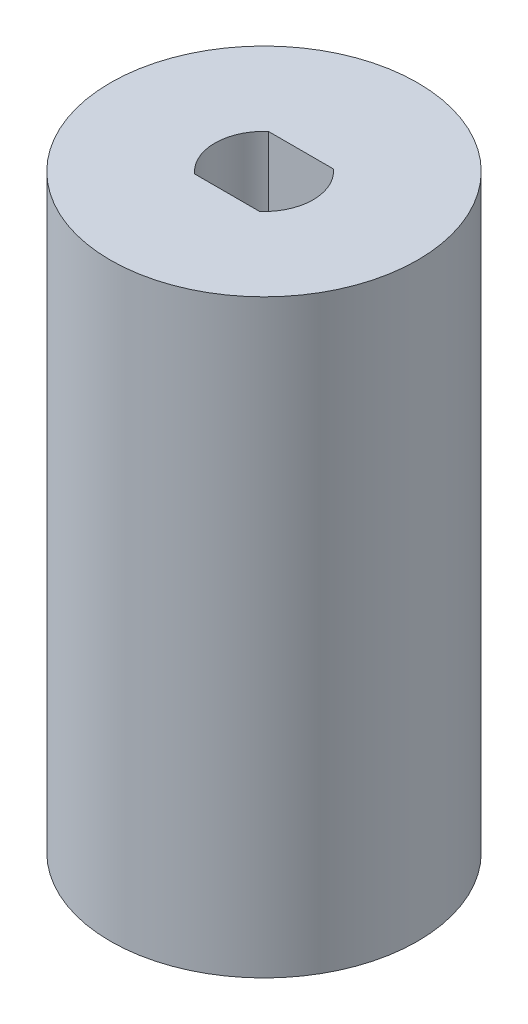
ISO-10303-21;
HEADER;
FILE_DESCRIPTION(('STEP AP214'),'2;1');
FILE_NAME('part.step','',(''),(''),'','','');
FILE_SCHEMA(('AUTOMOTIVE_DESIGN { 1 0 10303 214 1 1 1 1 }'));
ENDSEC;
DATA;
#1=APPLICATION_CONTEXT('core data for automotive mechanical design processes');
#2=APPLICATION_PROTOCOL_DEFINITION('international standard','automotive_design',2000,#1);
#3=PRODUCT_CONTEXT('',#1,'mechanical');
#4=PRODUCT('Part','Part','',(#3));
#5=PRODUCT_RELATED_PRODUCT_CATEGORY('part','',(#4));
#6=PRODUCT_DEFINITION_FORMATION('','',#4);
#7=PRODUCT_DEFINITION_CONTEXT('part definition',#1,'design');
#8=PRODUCT_DEFINITION('design','',#6,#7);
#9=PRODUCT_DEFINITION_SHAPE('','',#8);
#10=(LENGTH_UNIT() NAMED_UNIT(*) SI_UNIT(.MILLI.,.METRE.));
#11=(NAMED_UNIT(*) PLANE_ANGLE_UNIT() SI_UNIT($,.RADIAN.));
#12=(NAMED_UNIT(*) SI_UNIT($,.STERADIAN.) SOLID_ANGLE_UNIT());
#13=UNCERTAINTY_MEASURE_WITH_UNIT(LENGTH_MEASURE(1.E-05),#10,'distance_accuracy_value','');
#14=(GEOMETRIC_REPRESENTATION_CONTEXT(3) GLOBAL_UNCERTAINTY_ASSIGNED_CONTEXT((#13)) GLOBAL_UNIT_ASSIGNED_CONTEXT((#10,
#11,#12)) REPRESENTATION_CONTEXT('',''));
#15=CARTESIAN_POINT('',(0.,0.,0.));
#16=DIRECTION('',(0.,0.,1.));
#17=DIRECTION('',(1.,0.,0.));
#18=AXIS2_PLACEMENT_3D('',#15,#16,#17);
#19=CARTESIAN_POINT('',(0.,48.,0.));
#20=DIRECTION('',(0.,1.,0.));
#21=DIRECTION('',(0.,0.,1.));
#22=AXIS2_PLACEMENT_3D('',#19,#20,#21);
#23=PLANE('',#22);
#24=CARTESIAN_POINT('',(0.,48.,0.));
#25=DIRECTION('',(0.,1.,0.));
#26=DIRECTION('',(0.,0.,1.));
#27=AXIS2_PLACEMENT_3D('',#24,#25,#26);
#28=CIRCLE('',#27,12.5);
#29=CARTESIAN_POINT('',(0.,48.,12.5));
#30=VERTEX_POINT('',#29);
#31=EDGE_CURVE('E11',#30,#30,#28,.T.);
#32=ORIENTED_EDGE('',*,*,#31,.T.);
#33=EDGE_LOOP('',(#32));
#34=FACE_BOUND('',#33,.T.);
#35=DIRECTION('',(1.,0.,0.));
#36=VECTOR('',#35,1.);
#37=CARTESIAN_POINT('',(-2.64575131106459,48.,3.));
#38=LINE('',#37,#36);
#39=CARTESIAN_POINT('',(-2.64575131106459,48.,3.));
#40=VERTEX_POINT('',#39);
#41=CARTESIAN_POINT('',(2.64575131106459,48.,3.));
#42=VERTEX_POINT('',#41);
#43=EDGE_CURVE('E124',#40,#42,#38,.T.);
#44=ORIENTED_EDGE('',*,*,#43,.F.);
#45=CARTESIAN_POINT('',(0.,48.,0.));
#46=DIRECTION('',(0.,1.,0.));
#47=DIRECTION('',(0.,0.,1.));
#48=AXIS2_PLACEMENT_3D('',#45,#46,#47);
#49=CIRCLE('',#48,4.);
#50=CARTESIAN_POINT('',(-2.64575131106459,48.,-3.));
#51=VERTEX_POINT('',#50);
#52=EDGE_CURVE('E112',#51,#40,#49,.T.);
#53=ORIENTED_EDGE('',*,*,#52,.F.);
#54=DIRECTION('',(-1.,0.,0.));
#55=VECTOR('',#54,1.);
#56=CARTESIAN_POINT('',(-2.64575131106459,48.,-3.));
#57=LINE('',#56,#55);
#58=CARTESIAN_POINT('',(2.64575131106459,48.,-3.));
#59=VERTEX_POINT('',#58);
#60=EDGE_CURVE('E140',#59,#51,#57,.T.);
#61=ORIENTED_EDGE('',*,*,#60,.F.);
#62=CARTESIAN_POINT('',(0.,48.,0.));
#63=DIRECTION('',(0.,1.,0.));
#64=DIRECTION('',(0.,0.,1.));
#65=AXIS2_PLACEMENT_3D('',#62,#63,#64);
#66=CIRCLE('',#65,4.);
#67=EDGE_CURVE('E136',#42,#59,#66,.T.);
#68=ORIENTED_EDGE('',*,*,#67,.F.);
#69=EDGE_LOOP('',(#44,#53,#61,#68));
#70=FACE_BOUND('',#69,.T.);
#71=ADVANCED_FACE('F42',(#34,#70),#23,.T.);
#72=CARTESIAN_POINT('',(0.,0.,0.));
#73=DIRECTION('',(0.,1.,0.));
#74=DIRECTION('',(0.,0.,1.));
#75=AXIS2_PLACEMENT_3D('',#72,#73,#74);
#76=PLANE('',#75);
#77=CARTESIAN_POINT('',(0.,0.,0.));
#78=DIRECTION('',(0.,1.,0.));
#79=DIRECTION('',(0.,0.,1.));
#80=AXIS2_PLACEMENT_3D('',#77,#78,#79);
#81=CIRCLE('',#80,12.5);
#82=CARTESIAN_POINT('',(0.,0.,12.5));
#83=VERTEX_POINT('',#82);
#84=EDGE_CURVE('E46',#83,#83,#81,.T.);
#85=ORIENTED_EDGE('',*,*,#84,.F.);
#86=EDGE_LOOP('',(#85));
#87=FACE_BOUND('',#86,.T.);
#88=CARTESIAN_POINT('',(0.,0.,0.));
#89=DIRECTION('',(0.,1.,0.));
#90=DIRECTION('',(0.,0.,1.));
#91=AXIS2_PLACEMENT_3D('',#88,#89,#90);
#92=CIRCLE('',#91,4.);
#93=CARTESIAN_POINT('',(-2.64575131106459,0.,-3.));
#94=VERTEX_POINT('',#93);
#95=CARTESIAN_POINT('',(-2.64575131106459,0.,3.));
#96=VERTEX_POINT('',#95);
#97=EDGE_CURVE('E66',#94,#96,#92,.T.);
#98=ORIENTED_EDGE('',*,*,#97,.T.);
#99=DIRECTION('',(1.,0.,0.));
#100=VECTOR('',#99,1.);
#101=CARTESIAN_POINT('',(-2.64575131106459,0.,3.));
#102=LINE('',#101,#100);
#103=CARTESIAN_POINT('',(2.64575131106459,0.,3.));
#104=VERTEX_POINT('',#103);
#105=EDGE_CURVE('E178',#96,#104,#102,.T.);
#106=ORIENTED_EDGE('',*,*,#105,.T.);
#107=CARTESIAN_POINT('',(0.,0.,0.));
#108=DIRECTION('',(0.,1.,0.));
#109=DIRECTION('',(0.,0.,1.));
#110=AXIS2_PLACEMENT_3D('',#107,#108,#109);
#111=CIRCLE('',#110,4.);
#112=CARTESIAN_POINT('',(2.64575131106459,0.,-3.));
#113=VERTEX_POINT('',#112);
#114=EDGE_CURVE('E182',#104,#113,#111,.T.);
#115=ORIENTED_EDGE('',*,*,#114,.T.);
#116=DIRECTION('',(-1.,0.,0.));
#117=VECTOR('',#116,1.);
#118=CARTESIAN_POINT('',(-2.64575131106459,0.,-3.));
#119=LINE('',#118,#117);
#120=EDGE_CURVE('E166',#113,#94,#119,.T.);
#121=ORIENTED_EDGE('',*,*,#120,.T.);
#122=EDGE_LOOP('',(#98,#106,#115,#121));
#123=FACE_BOUND('',#122,.T.);
#124=ADVANCED_FACE('F205',(#87,#123),#76,.F.);
#125=CARTESIAN_POINT('',(0.,48.,0.));
#126=DIRECTION('',(0.,-1.,0.));
#127=DIRECTION('',(0.,0.,-1.));
#128=AXIS2_PLACEMENT_3D('',#125,#126,#127);
#129=CYLINDRICAL_SURFACE('',#128,12.5);
#130=ORIENTED_EDGE('',*,*,#31,.F.);
#131=EDGE_LOOP('',(#130));
#132=FACE_BOUND('',#131,.T.);
#133=ORIENTED_EDGE('',*,*,#84,.T.);
#134=EDGE_LOOP('',(#133));
#135=FACE_BOUND('',#134,.T.);
#136=ADVANCED_FACE('F44',(#132,#135),#129,.T.);
#137=CARTESIAN_POINT('',(0.,15.,0.));
#138=DIRECTION('',(0.,-1.,0.));
#139=DIRECTION('',(0.,0.,-1.));
#140=AXIS2_PLACEMENT_3D('',#137,#138,#139);
#141=CYLINDRICAL_SURFACE('',#140,4.);
#142=ORIENTED_EDGE('',*,*,#97,.F.);
#143=DIRECTION('',(0.,-1.,0.));
#144=VECTOR('',#143,1.);
#145=CARTESIAN_POINT('',(-2.64575131106459,15.,-3.));
#146=LINE('',#145,#144);
#147=CARTESIAN_POINT('',(-2.64575131106459,15.,-3.));
#148=VERTEX_POINT('',#147);
#149=EDGE_CURVE('E175',#148,#94,#146,.T.);
#150=ORIENTED_EDGE('',*,*,#149,.F.);
#151=CARTESIAN_POINT('',(0.,15.,0.));
#152=DIRECTION('',(0.,1.,0.));
#153=DIRECTION('',(0.,0.,1.));
#154=AXIS2_PLACEMENT_3D('',#151,#152,#153);
#155=CIRCLE('',#154,4.);
#156=CARTESIAN_POINT('',(-2.64575131106459,15.,3.));
#157=VERTEX_POINT('',#156);
#158=EDGE_CURVE('E161',#148,#157,#155,.T.);
#159=ORIENTED_EDGE('',*,*,#158,.T.);
#160=DIRECTION('',(0.,-1.,0.));
#161=VECTOR('',#160,1.);
#162=CARTESIAN_POINT('',(-2.64575131106459,15.,3.));
#163=LINE('',#162,#161);
#164=EDGE_CURVE('E197',#157,#96,#163,.T.);
#165=ORIENTED_EDGE('',*,*,#164,.T.);
#166=EDGE_LOOP('',(#142,#150,#159,#165));
#167=FACE_BOUND('',#166,.T.);
#168=ADVANCED_FACE('F215',(#167),#141,.F.);
#169=CARTESIAN_POINT('',(-2.64575131106459,15.,3.));
#170=DIRECTION('',(0.,0.,-1.));
#171=DIRECTION('',(-1.,0.,0.));
#172=AXIS2_PLACEMENT_3D('',#169,#170,#171);
#173=PLANE('',#172);
#174=ORIENTED_EDGE('',*,*,#105,.F.);
#175=ORIENTED_EDGE('',*,*,#164,.F.);
#176=DIRECTION('',(1.,0.,0.));
#177=VECTOR('',#176,1.);
#178=CARTESIAN_POINT('',(-2.64575131106459,15.,3.));
#179=LINE('',#178,#177);
#180=CARTESIAN_POINT('',(2.64575131106459,15.,3.));
#181=VERTEX_POINT('',#180);
#182=EDGE_CURVE('E165',#157,#181,#179,.T.);
#183=ORIENTED_EDGE('',*,*,#182,.T.);
#184=DIRECTION('',(0.,-1.,0.));
#185=VECTOR('',#184,1.);
#186=CARTESIAN_POINT('',(2.64575131106459,15.,3.));
#187=LINE('',#186,#185);
#188=EDGE_CURVE('E194',#181,#104,#187,.T.);
#189=ORIENTED_EDGE('',*,*,#188,.T.);
#190=EDGE_LOOP('',(#174,#175,#183,#189));
#191=FACE_BOUND('',#190,.T.);
#192=ADVANCED_FACE('F221',(#191),#173,.T.);
#193=CARTESIAN_POINT('',(0.,15.,0.));
#194=DIRECTION('',(0.,-1.,0.));
#195=DIRECTION('',(0.,0.,-1.));
#196=AXIS2_PLACEMENT_3D('',#193,#194,#195);
#197=CYLINDRICAL_SURFACE('',#196,4.);
#198=ORIENTED_EDGE('',*,*,#114,.F.);
#199=ORIENTED_EDGE('',*,*,#188,.F.);
#200=CARTESIAN_POINT('',(0.,15.,0.));
#201=DIRECTION('',(0.,1.,0.));
#202=DIRECTION('',(0.,0.,1.));
#203=AXIS2_PLACEMENT_3D('',#200,#201,#202);
#204=CIRCLE('',#203,4.);
#205=CARTESIAN_POINT('',(2.64575131106459,15.,-3.));
#206=VERTEX_POINT('',#205);
#207=EDGE_CURVE('E169',#181,#206,#204,.T.);
#208=ORIENTED_EDGE('',*,*,#207,.T.);
#209=DIRECTION('',(0.,-1.,0.));
#210=VECTOR('',#209,1.);
#211=CARTESIAN_POINT('',(2.64575131106459,15.,-3.));
#212=LINE('',#211,#210);
#213=EDGE_CURVE('E191',#206,#113,#212,.T.);
#214=ORIENTED_EDGE('',*,*,#213,.T.);
#215=EDGE_LOOP('',(#198,#199,#208,#214));
#216=FACE_BOUND('',#215,.T.);
#217=ADVANCED_FACE('F223',(#216),#197,.F.);
#218=CARTESIAN_POINT('',(-2.64575131106459,15.,-3.));
#219=DIRECTION('',(0.,0.,1.));
#220=DIRECTION('',(1.,0.,0.));
#221=AXIS2_PLACEMENT_3D('',#218,#219,#220);
#222=PLANE('',#221);
#223=ORIENTED_EDGE('',*,*,#120,.F.);
#224=ORIENTED_EDGE('',*,*,#213,.F.);
#225=DIRECTION('',(-1.,0.,0.));
#226=VECTOR('',#225,1.);
#227=CARTESIAN_POINT('',(-2.64575131106459,15.,-3.));
#228=LINE('',#227,#226);
#229=EDGE_CURVE('E172',#206,#148,#228,.T.);
#230=ORIENTED_EDGE('',*,*,#229,.T.);
#231=ORIENTED_EDGE('',*,*,#149,.T.);
#232=EDGE_LOOP('',(#223,#224,#230,#231));
#233=FACE_BOUND('',#232,.T.);
#234=ADVANCED_FACE('F212',(#233),#222,.T.);
#235=CARTESIAN_POINT('',(0.,15.,0.));
#236=DIRECTION('',(0.,1.,0.));
#237=DIRECTION('',(0.,0.,1.));
#238=AXIS2_PLACEMENT_3D('',#235,#236,#237);
#239=PLANE('',#238);
#240=ORIENTED_EDGE('',*,*,#158,.F.);
#241=ORIENTED_EDGE('',*,*,#229,.F.);
#242=ORIENTED_EDGE('',*,*,#207,.F.);
#243=ORIENTED_EDGE('',*,*,#182,.F.);
#244=EDGE_LOOP('',(#240,#241,#242,#243));
#245=FACE_BOUND('',#244,.T.);
#246=ADVANCED_FACE('F217',(#245),#239,.F.);
#247=CARTESIAN_POINT('',(0.,48.,0.));
#248=DIRECTION('',(0.,-1.,0.));
#249=DIRECTION('',(0.,0.,-1.));
#250=AXIS2_PLACEMENT_3D('',#247,#248,#249);
#251=CYLINDRICAL_SURFACE('',#250,4.);
#252=CARTESIAN_POINT('',(0.,33.,0.));
#253=DIRECTION('',(0.,1.,0.));
#254=DIRECTION('',(0.,0.,1.));
#255=AXIS2_PLACEMENT_3D('',#252,#253,#254);
#256=CIRCLE('',#255,4.);
#257=CARTESIAN_POINT('',(-2.64575131106459,33.,-3.));
#258=VERTEX_POINT('',#257);
#259=CARTESIAN_POINT('',(-2.64575131106459,33.,3.));
#260=VERTEX_POINT('',#259);
#261=EDGE_CURVE('E145',#258,#260,#256,.T.);
#262=ORIENTED_EDGE('',*,*,#261,.F.);
#263=DIRECTION('',(0.,-1.,0.));
#264=VECTOR('',#263,1.);
#265=CARTESIAN_POINT('',(-2.64575131106459,48.,-3.));
#266=LINE('',#265,#264);
#267=EDGE_CURVE('E119',#51,#258,#266,.T.);
#268=ORIENTED_EDGE('',*,*,#267,.F.);
#269=ORIENTED_EDGE('',*,*,#52,.T.);
#270=DIRECTION('',(0.,-1.,0.));
#271=VECTOR('',#270,1.);
#272=CARTESIAN_POINT('',(-2.64575131106459,48.,3.));
#273=LINE('',#272,#271);
#274=EDGE_CURVE('E116',#40,#260,#273,.T.);
#275=ORIENTED_EDGE('',*,*,#274,.T.);
#276=EDGE_LOOP('',(#262,#268,#269,#275));
#277=FACE_BOUND('',#276,.T.);
#278=ADVANCED_FACE('F115',(#277),#251,.F.);
#279=CARTESIAN_POINT('',(-2.64575131106459,48.,3.));
#280=DIRECTION('',(0.,0.,-1.));
#281=DIRECTION('',(-1.,0.,0.));
#282=AXIS2_PLACEMENT_3D('',#279,#280,#281);
#283=PLANE('',#282);
#284=DIRECTION('',(1.,0.,0.));
#285=VECTOR('',#284,1.);
#286=CARTESIAN_POINT('',(-2.64575131106459,33.,3.));
#287=LINE('',#286,#285);
#288=CARTESIAN_POINT('',(2.64575131106459,33.,3.));
#289=VERTEX_POINT('',#288);
#290=EDGE_CURVE('E131',#260,#289,#287,.T.);
#291=ORIENTED_EDGE('',*,*,#290,.F.);
#292=ORIENTED_EDGE('',*,*,#274,.F.);
#293=ORIENTED_EDGE('',*,*,#43,.T.);
#294=DIRECTION('',(0.,-1.,0.));
#295=VECTOR('',#294,1.);
#296=CARTESIAN_POINT('',(2.64575131106459,48.,3.));
#297=LINE('',#296,#295);
#298=EDGE_CURVE('E133',#42,#289,#297,.T.);
#299=ORIENTED_EDGE('',*,*,#298,.T.);
#300=EDGE_LOOP('',(#291,#292,#293,#299));
#301=FACE_BOUND('',#300,.T.);
#302=ADVANCED_FACE('F128',(#301),#283,.T.);
#303=CARTESIAN_POINT('',(0.,48.,0.));
#304=DIRECTION('',(0.,-1.,0.));
#305=DIRECTION('',(0.,0.,-1.));
#306=AXIS2_PLACEMENT_3D('',#303,#304,#305);
#307=CYLINDRICAL_SURFACE('',#306,4.);
#308=CARTESIAN_POINT('',(0.,33.,0.));
#309=DIRECTION('',(0.,1.,0.));
#310=DIRECTION('',(0.,0.,1.));
#311=AXIS2_PLACEMENT_3D('',#308,#309,#310);
#312=CIRCLE('',#311,4.);
#313=CARTESIAN_POINT('',(2.64575131106459,33.,-3.));
#314=VERTEX_POINT('',#313);
#315=EDGE_CURVE('E150',#289,#314,#312,.T.);
#316=ORIENTED_EDGE('',*,*,#315,.F.);
#317=ORIENTED_EDGE('',*,*,#298,.F.);
#318=ORIENTED_EDGE('',*,*,#67,.T.);
#319=DIRECTION('',(0.,-1.,0.));
#320=VECTOR('',#319,1.);
#321=CARTESIAN_POINT('',(2.64575131106459,48.,-3.));
#322=LINE('',#321,#320);
#323=EDGE_CURVE('E58',#59,#314,#322,.T.);
#324=ORIENTED_EDGE('',*,*,#323,.T.);
#325=EDGE_LOOP('',(#316,#317,#318,#324));
#326=FACE_BOUND('',#325,.T.);
#327=ADVANCED_FACE('F306',(#326),#307,.F.);
#328=CARTESIAN_POINT('',(-2.64575131106459,48.,-3.));
#329=DIRECTION('',(0.,0.,1.));
#330=DIRECTION('',(1.,0.,0.));
#331=AXIS2_PLACEMENT_3D('',#328,#329,#330);
#332=PLANE('',#331);
#333=DIRECTION('',(-1.,0.,0.));
#334=VECTOR('',#333,1.);
#335=CARTESIAN_POINT('',(-2.64575131106459,33.,-3.));
#336=LINE('',#335,#334);
#337=EDGE_CURVE('E125',#314,#258,#336,.T.);
#338=ORIENTED_EDGE('',*,*,#337,.F.);
#339=ORIENTED_EDGE('',*,*,#323,.F.);
#340=ORIENTED_EDGE('',*,*,#60,.T.);
#341=ORIENTED_EDGE('',*,*,#267,.T.);
#342=EDGE_LOOP('',(#338,#339,#340,#341));
#343=FACE_BOUND('',#342,.T.);
#344=ADVANCED_FACE('F316',(#343),#332,.T.);
#345=CARTESIAN_POINT('',(0.,33.,0.));
#346=DIRECTION('',(0.,1.,0.));
#347=DIRECTION('',(0.,0.,1.));
#348=AXIS2_PLACEMENT_3D('',#345,#346,#347);
#349=PLANE('',#348);
#350=ORIENTED_EDGE('',*,*,#261,.T.);
#351=ORIENTED_EDGE('',*,*,#290,.T.);
#352=ORIENTED_EDGE('',*,*,#315,.T.);
#353=ORIENTED_EDGE('',*,*,#337,.T.);
#354=EDGE_LOOP('',(#350,#351,#352,#353));
#355=FACE_BOUND('',#354,.T.);
#356=ADVANCED_FACE('F327',(#355),#349,.T.);
#357=CLOSED_SHELL('',(#71,#124,#136,#168,#192,#217,#234,#246,#278,#302,#327,#344,#356));
#358=MANIFOLD_SOLID_BREP('B2',#357);
#359=ADVANCED_BREP_SHAPE_REPRESENTATION('',(#18,#358),#14);
#360=SHAPE_DEFINITION_REPRESENTATION(#9,#359);
ENDSEC;
END-ISO-10303-21;
